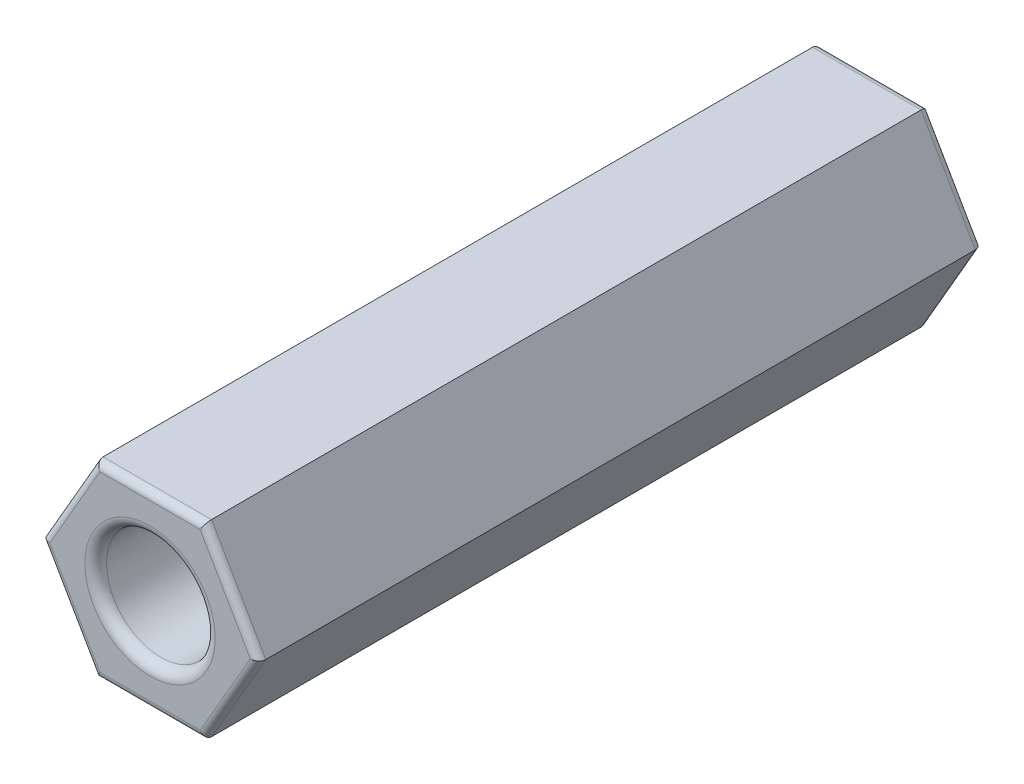
ISO-10303-21;
HEADER;
FILE_DESCRIPTION(('STEP AP214'),'2;1');
FILE_NAME('part.step','',(''),(''),'','','');
FILE_SCHEMA(('AUTOMOTIVE_DESIGN { 1 0 10303 214 1 1 1 1 }'));
ENDSEC;
DATA;
#1=APPLICATION_CONTEXT('core data for automotive mechanical design processes');
#2=APPLICATION_PROTOCOL_DEFINITION('international standard','automotive_design',2000,#1);
#3=PRODUCT_CONTEXT('',#1,'mechanical');
#4=PRODUCT('Part','Part','',(#3));
#5=PRODUCT_RELATED_PRODUCT_CATEGORY('part','',(#4));
#6=PRODUCT_DEFINITION_FORMATION('','',#4);
#7=PRODUCT_DEFINITION_CONTEXT('part definition',#1,'design');
#8=PRODUCT_DEFINITION('design','',#6,#7);
#9=PRODUCT_DEFINITION_SHAPE('','',#8);
#10=(LENGTH_UNIT() NAMED_UNIT(*) SI_UNIT(.MILLI.,.METRE.));
#11=(NAMED_UNIT(*) PLANE_ANGLE_UNIT() SI_UNIT($,.RADIAN.));
#12=(NAMED_UNIT(*) SI_UNIT($,.STERADIAN.) SOLID_ANGLE_UNIT());
#13=UNCERTAINTY_MEASURE_WITH_UNIT(LENGTH_MEASURE(1.E-05),#10,'distance_accuracy_value','');
#14=(GEOMETRIC_REPRESENTATION_CONTEXT(3) GLOBAL_UNCERTAINTY_ASSIGNED_CONTEXT((#13)) GLOBAL_UNIT_ASSIGNED_CONTEXT((#10,
#11,#12)) REPRESENTATION_CONTEXT('',''));
#15=CARTESIAN_POINT('',(0.,0.,0.));
#16=DIRECTION('',(0.,0.,1.));
#17=DIRECTION('',(1.,0.,0.));
#18=AXIS2_PLACEMENT_3D('',#15,#16,#17);
#19=CARTESIAN_POINT('',(0.,0.,20.));
#20=DIRECTION('',(0.,0.,1.));
#21=DIRECTION('',(1.,0.,0.));
#22=AXIS2_PLACEMENT_3D('',#19,#20,#21);
#23=PLANE('',#22);
#24=DIRECTION('',(-1.,0.,0.));
#25=VECTOR('',#24,1.);
#26=CARTESIAN_POINT('',(-1.50000000000001,2.39807621135331,20.));
#27=LINE('',#26,#25);
#28=CARTESIAN_POINT('',(1.38452994616207,2.39807621135332,20.));
#29=VERTEX_POINT('',#28);
#30=CARTESIAN_POINT('',(-1.38452994616209,2.39807621135331,20.));
#31=VERTEX_POINT('',#30);
#32=EDGE_CURVE('E128',#29,#31,#27,.T.);
#33=ORIENTED_EDGE('',*,*,#32,.T.);
#34=DIRECTION('',(-0.499999999999995,-0.866025403784442,0.));
#35=VECTOR('',#34,1.);
#36=CARTESIAN_POINT('',(-2.82679491924311,-0.10000000000002,20.));
#37=LINE('',#36,#35);
#38=CARTESIAN_POINT('',(-2.76905989232415,0.,20.));
#39=VERTEX_POINT('',#38);
#40=EDGE_CURVE('E161',#31,#39,#37,.T.);
#41=ORIENTED_EDGE('',*,*,#40,.T.);
#42=DIRECTION('',(0.500000000000007,-0.866025403784435,0.));
#43=VECTOR('',#42,1.);
#44=CARTESIAN_POINT('',(-1.32679491924309,-2.49807621135333,20.));
#45=LINE('',#44,#43);
#46=CARTESIAN_POINT('',(-1.38452994616205,-2.39807621135333,20.));
#47=VERTEX_POINT('',#46);
#48=EDGE_CURVE('E159',#39,#47,#45,.T.);
#49=ORIENTED_EDGE('',*,*,#48,.T.);
#50=DIRECTION('',(1.,0.,0.));
#51=VECTOR('',#50,1.);
#52=CARTESIAN_POINT('',(1.50000000000003,-2.3980762113533,20.));
#53=LINE('',#52,#51);
#54=CARTESIAN_POINT('',(1.3845299461621,-2.3980762113533,20.));
#55=VERTEX_POINT('',#54);
#56=EDGE_CURVE('E157',#47,#55,#53,.T.);
#57=ORIENTED_EDGE('',*,*,#56,.T.);
#58=DIRECTION('',(0.499999999999995,0.866025403784442,0.));
#59=VECTOR('',#58,1.);
#60=CARTESIAN_POINT('',(2.82679491924311,0.0999999999999994,20.));
#61=LINE('',#60,#59);
#62=CARTESIAN_POINT('',(2.76905989232415,0.,20.));
#63=VERTEX_POINT('',#62);
#64=EDGE_CURVE('E131',#55,#63,#61,.T.);
#65=ORIENTED_EDGE('',*,*,#64,.T.);
#66=DIRECTION('',(-0.500000000000001,0.866025403784438,0.));
#67=VECTOR('',#66,1.);
#68=CARTESIAN_POINT('',(1.32679491924311,2.49807621135332,20.));
#69=LINE('',#68,#67);
#70=EDGE_CURVE('E123',#63,#29,#69,.T.);
#71=ORIENTED_EDGE('',*,*,#70,.T.);
#72=EDGE_LOOP('',(#33,#41,#49,#57,#65,#71));
#73=FACE_BOUND('',#72,.T.);
#74=CARTESIAN_POINT('',(0.,0.,20.));
#75=DIRECTION('',(0.,0.,1.));
#76=DIRECTION('',(1.,0.,0.));
#77=AXIS2_PLACEMENT_3D('',#74,#75,#76);
#78=CIRCLE('',#77,1.8);
#79=CARTESIAN_POINT('',(1.8,0.,20.));
#80=VERTEX_POINT('',#79);
#81=EDGE_CURVE('E149',#80,#80,#78,.F.);
#82=ORIENTED_EDGE('',*,*,#81,.T.);
#83=EDGE_LOOP('',(#82));
#84=FACE_BOUND('',#83,.T.);
#85=ADVANCED_FACE('F33',(#73,#84),#23,.T.);
#86=CARTESIAN_POINT('',(0.,0.,0.));
#87=DIRECTION('',(0.,0.,1.));
#88=DIRECTION('',(1.,0.,0.));
#89=AXIS2_PLACEMENT_3D('',#86,#87,#88);
#90=PLANE('',#89);
#91=DIRECTION('',(-0.500000000000001,0.866025403784438,0.));
#92=VECTOR('',#91,1.);
#93=CARTESIAN_POINT('',(2.07679491924311,1.19903810567666,0.));
#94=LINE('',#93,#92);
#95=CARTESIAN_POINT('',(1.38452994616207,2.39807621135332,0.));
#96=VERTEX_POINT('',#95);
#97=CARTESIAN_POINT('',(2.76905989232415,0.,0.));
#98=VERTEX_POINT('',#97);
#99=EDGE_CURVE('E188',#96,#98,#94,.F.);
#100=ORIENTED_EDGE('',*,*,#99,.T.);
#101=DIRECTION('',(0.499999999999995,0.866025403784442,0.));
#102=VECTOR('',#101,1.);
#103=CARTESIAN_POINT('',(2.07679491924313,-1.19903810567665,0.));
#104=LINE('',#103,#102);
#105=CARTESIAN_POINT('',(1.3845299461621,-2.3980762113533,0.));
#106=VERTEX_POINT('',#105);
#107=EDGE_CURVE('E11',#98,#106,#104,.F.);
#108=ORIENTED_EDGE('',*,*,#107,.T.);
#109=DIRECTION('',(1.,0.,0.));
#110=VECTOR('',#109,1.);
#111=CARTESIAN_POINT('',(0.,-2.39807621135331,0.));
#112=LINE('',#111,#110);
#113=CARTESIAN_POINT('',(-1.38452994616205,-2.39807621135333,0.));
#114=VERTEX_POINT('',#113);
#115=EDGE_CURVE('E42',#106,#114,#112,.F.);
#116=ORIENTED_EDGE('',*,*,#115,.T.);
#117=DIRECTION('',(0.500000000000007,-0.866025403784435,0.));
#118=VECTOR('',#117,1.);
#119=CARTESIAN_POINT('',(-2.0767949192431,-1.19903810567667,0.));
#120=LINE('',#119,#118);
#121=CARTESIAN_POINT('',(-2.76905989232415,0.,0.));
#122=VERTEX_POINT('',#121);
#123=EDGE_CURVE('E194',#114,#122,#120,.F.);
#124=ORIENTED_EDGE('',*,*,#123,.T.);
#125=DIRECTION('',(-0.499999999999995,-0.866025403784442,0.));
#126=VECTOR('',#125,1.);
#127=CARTESIAN_POINT('',(-2.07679491924312,1.19903810567665,0.));
#128=LINE('',#127,#126);
#129=CARTESIAN_POINT('',(-1.38452994616209,2.39807621135331,0.));
#130=VERTEX_POINT('',#129);
#131=EDGE_CURVE('E192',#122,#130,#128,.F.);
#132=ORIENTED_EDGE('',*,*,#131,.T.);
#133=DIRECTION('',(-1.,0.,0.));
#134=VECTOR('',#133,1.);
#135=CARTESIAN_POINT('',(0.,2.39807621135331,0.));
#136=LINE('',#135,#134);
#137=EDGE_CURVE('E190',#130,#96,#136,.F.);
#138=ORIENTED_EDGE('',*,*,#137,.T.);
#139=EDGE_LOOP('',(#100,#108,#116,#124,#132,#138));
#140=FACE_BOUND('',#139,.T.);
#141=CARTESIAN_POINT('',(0.,0.,0.));
#142=DIRECTION('',(0.,0.,1.));
#143=DIRECTION('',(1.,0.,0.));
#144=AXIS2_PLACEMENT_3D('',#141,#142,#143);
#145=CIRCLE('',#144,1.8);
#146=CARTESIAN_POINT('',(1.8,0.,0.));
#147=VERTEX_POINT('',#146);
#148=EDGE_CURVE('E252',#147,#147,#145,.T.);
#149=ORIENTED_EDGE('',*,*,#148,.T.);
#150=EDGE_LOOP('',(#149));
#151=FACE_BOUND('',#150,.T.);
#152=ADVANCED_FACE('F230',(#140,#151),#90,.F.);
#153=CARTESIAN_POINT('',(1.50000000000003,-2.5980762113533,20.));
#154=DIRECTION('',(-0.866025403784442,0.499999999999995,0.));
#155=DIRECTION('',(-0.499999999999995,-0.866025403784442,0.));
#156=AXIS2_PLACEMENT_3D('',#153,#154,#155);
#157=PLANE('',#156);
#158=DIRECTION('',(0.,0.,-1.));
#159=VECTOR('',#158,1.);
#160=CARTESIAN_POINT('',(3.,0.,20.));
#161=LINE('',#160,#159);
#162=CARTESIAN_POINT('',(3.,0.,19.8));
#163=VERTEX_POINT('',#162);
#164=CARTESIAN_POINT('',(3.,0.,0.199999999999999));
#165=VERTEX_POINT('',#164);
#166=EDGE_CURVE('E245',#163,#165,#161,.T.);
#167=ORIENTED_EDGE('',*,*,#166,.F.);
#168=DIRECTION('',(0.499999999999995,0.866025403784442,0.));
#169=VECTOR('',#168,1.);
#170=CARTESIAN_POINT('',(1.50000000000003,-2.5980762113533,19.8));
#171=LINE('',#170,#169);
#172=CARTESIAN_POINT('',(1.50000000000003,-2.5980762113533,19.8));
#173=VERTEX_POINT('',#172);
#174=EDGE_CURVE('E179',#163,#173,#171,.F.);
#175=ORIENTED_EDGE('',*,*,#174,.T.);
#176=DIRECTION('',(0.,0.,-1.));
#177=VECTOR('',#176,1.);
#178=CARTESIAN_POINT('',(1.50000000000003,-2.5980762113533,20.));
#179=LINE('',#178,#177);
#180=CARTESIAN_POINT('',(1.50000000000003,-2.5980762113533,0.199999999999999));
#181=VERTEX_POINT('',#180);
#182=EDGE_CURVE('E206',#173,#181,#179,.T.);
#183=ORIENTED_EDGE('',*,*,#182,.T.);
#184=DIRECTION('',(0.499999999999995,0.866025403784442,0.));
#185=VECTOR('',#184,1.);
#186=CARTESIAN_POINT('',(1.50000000000003,-2.5980762113533,0.199999999999999));
#187=LINE('',#186,#185);
#188=EDGE_CURVE('E176',#181,#165,#187,.T.);
#189=ORIENTED_EDGE('',*,*,#188,.T.);
#190=EDGE_LOOP('',(#167,#175,#183,#189));
#191=FACE_BOUND('',#190,.T.);
#192=ADVANCED_FACE('F244',(#191),#157,.F.);
#193=CARTESIAN_POINT('',(3.,0.,20.));
#194=DIRECTION('',(-0.866025403784438,-0.500000000000001,0.));
#195=DIRECTION('',(0.500000000000001,-0.866025403784438,0.));
#196=AXIS2_PLACEMENT_3D('',#193,#194,#195);
#197=PLANE('',#196);
#198=DIRECTION('',(0.,0.,-1.));
#199=VECTOR('',#198,1.);
#200=CARTESIAN_POINT('',(1.49999999999999,2.59807621135332,20.));
#201=LINE('',#200,#199);
#202=CARTESIAN_POINT('',(1.49999999999999,2.59807621135332,19.8));
#203=VERTEX_POINT('',#202);
#204=CARTESIAN_POINT('',(1.49999999999999,2.59807621135332,0.199999999999999));
#205=VERTEX_POINT('',#204);
#206=EDGE_CURVE('E253',#203,#205,#201,.T.);
#207=ORIENTED_EDGE('',*,*,#206,.F.);
#208=DIRECTION('',(-0.500000000000001,0.866025403784438,0.));
#209=VECTOR('',#208,1.);
#210=CARTESIAN_POINT('',(3.,0.,19.8));
#211=LINE('',#210,#209);
#212=EDGE_CURVE('E140',#203,#163,#211,.F.);
#213=ORIENTED_EDGE('',*,*,#212,.T.);
#214=ORIENTED_EDGE('',*,*,#166,.T.);
#215=DIRECTION('',(-0.500000000000001,0.866025403784438,0.));
#216=VECTOR('',#215,1.);
#217=CARTESIAN_POINT('',(3.,0.,0.199999999999999));
#218=LINE('',#217,#216);
#219=EDGE_CURVE('E181',#165,#205,#218,.T.);
#220=ORIENTED_EDGE('',*,*,#219,.T.);
#221=EDGE_LOOP('',(#207,#213,#214,#220));
#222=FACE_BOUND('',#221,.T.);
#223=ADVANCED_FACE('F250',(#222),#197,.F.);
#224=CARTESIAN_POINT('',(1.49999999999999,2.59807621135332,20.));
#225=DIRECTION('',(0.,-1.,0.));
#226=DIRECTION('',(1.,0.,0.));
#227=AXIS2_PLACEMENT_3D('',#224,#225,#226);
#228=PLANE('',#227);
#229=DIRECTION('',(0.,0.,-1.));
#230=VECTOR('',#229,1.);
#231=CARTESIAN_POINT('',(-1.50000000000001,2.59807621135331,20.));
#232=LINE('',#231,#230);
#233=CARTESIAN_POINT('',(-1.50000000000001,2.59807621135331,19.8));
#234=VERTEX_POINT('',#233);
#235=CARTESIAN_POINT('',(-1.50000000000001,2.59807621135331,0.199999999999999));
#236=VERTEX_POINT('',#235);
#237=EDGE_CURVE('E258',#234,#236,#232,.T.);
#238=ORIENTED_EDGE('',*,*,#237,.F.);
#239=DIRECTION('',(-1.,0.,0.));
#240=VECTOR('',#239,1.);
#241=CARTESIAN_POINT('',(1.49999999999999,2.59807621135332,19.8));
#242=LINE('',#241,#240);
#243=EDGE_CURVE('E186',#234,#203,#242,.F.);
#244=ORIENTED_EDGE('',*,*,#243,.T.);
#245=ORIENTED_EDGE('',*,*,#206,.T.);
#246=DIRECTION('',(-1.,0.,0.));
#247=VECTOR('',#246,1.);
#248=CARTESIAN_POINT('',(1.49999999999999,2.59807621135332,0.199999999999999));
#249=LINE('',#248,#247);
#250=EDGE_CURVE('E184',#205,#236,#249,.T.);
#251=ORIENTED_EDGE('',*,*,#250,.T.);
#252=EDGE_LOOP('',(#238,#244,#245,#251));
#253=FACE_BOUND('',#252,.T.);
#254=ADVANCED_FACE('F296',(#253),#228,.F.);
#255=CARTESIAN_POINT('',(-1.50000000000001,2.59807621135331,20.));
#256=DIRECTION('',(0.866025403784442,-0.499999999999995,0.));
#257=DIRECTION('',(0.499999999999995,0.866025403784442,0.));
#258=AXIS2_PLACEMENT_3D('',#255,#256,#257);
#259=PLANE('',#258);
#260=DIRECTION('',(0.,0.,-1.));
#261=VECTOR('',#260,1.);
#262=CARTESIAN_POINT('',(-3.,0.,20.));
#263=LINE('',#262,#261);
#264=CARTESIAN_POINT('',(-3.,0.,19.8));
#265=VERTEX_POINT('',#264);
#266=CARTESIAN_POINT('',(-3.,0.,0.199999999999999));
#267=VERTEX_POINT('',#266);
#268=EDGE_CURVE('E481',#265,#267,#263,.T.);
#269=ORIENTED_EDGE('',*,*,#268,.F.);
#270=DIRECTION('',(-0.499999999999995,-0.866025403784442,0.));
#271=VECTOR('',#270,1.);
#272=CARTESIAN_POINT('',(-1.50000000000001,2.59807621135331,19.8));
#273=LINE('',#272,#271);
#274=EDGE_CURVE('E165',#265,#234,#273,.F.);
#275=ORIENTED_EDGE('',*,*,#274,.T.);
#276=ORIENTED_EDGE('',*,*,#237,.T.);
#277=DIRECTION('',(-0.499999999999995,-0.866025403784442,0.));
#278=VECTOR('',#277,1.);
#279=CARTESIAN_POINT('',(-1.50000000000001,2.59807621135331,0.199999999999999));
#280=LINE('',#279,#278);
#281=EDGE_CURVE('E163',#236,#267,#280,.T.);
#282=ORIENTED_EDGE('',*,*,#281,.T.);
#283=EDGE_LOOP('',(#269,#275,#276,#282));
#284=FACE_BOUND('',#283,.T.);
#285=ADVANCED_FACE('F292',(#284),#259,.F.);
#286=CARTESIAN_POINT('',(-3.,0.,20.));
#287=DIRECTION('',(0.866025403784435,0.500000000000007,0.));
#288=DIRECTION('',(-0.500000000000007,0.866025403784435,0.));
#289=AXIS2_PLACEMENT_3D('',#286,#287,#288);
#290=PLANE('',#289);
#291=DIRECTION('',(0.,0.,-1.));
#292=VECTOR('',#291,1.);
#293=CARTESIAN_POINT('',(-1.49999999999998,-2.59807621135333,20.));
#294=LINE('',#293,#292);
#295=CARTESIAN_POINT('',(-1.49999999999998,-2.59807621135333,19.8));
#296=VERTEX_POINT('',#295);
#297=CARTESIAN_POINT('',(-1.49999999999998,-2.59807621135333,0.199999999999999));
#298=VERTEX_POINT('',#297);
#299=EDGE_CURVE('E478',#296,#298,#294,.T.);
#300=ORIENTED_EDGE('',*,*,#299,.F.);
#301=DIRECTION('',(0.500000000000007,-0.866025403784435,0.));
#302=VECTOR('',#301,1.);
#303=CARTESIAN_POINT('',(-3.,0.,19.8));
#304=LINE('',#303,#302);
#305=EDGE_CURVE('E170',#296,#265,#304,.F.);
#306=ORIENTED_EDGE('',*,*,#305,.T.);
#307=ORIENTED_EDGE('',*,*,#268,.T.);
#308=DIRECTION('',(0.500000000000007,-0.866025403784435,0.));
#309=VECTOR('',#308,1.);
#310=CARTESIAN_POINT('',(-3.,0.,0.199999999999999));
#311=LINE('',#310,#309);
#312=EDGE_CURVE('E168',#267,#298,#311,.T.);
#313=ORIENTED_EDGE('',*,*,#312,.T.);
#314=EDGE_LOOP('',(#300,#306,#307,#313));
#315=FACE_BOUND('',#314,.T.);
#316=ADVANCED_FACE('F288',(#315),#290,.F.);
#317=CARTESIAN_POINT('',(-1.49999999999998,-2.59807621135333,20.));
#318=DIRECTION('',(0.,1.,0.));
#319=DIRECTION('',(-1.,0.,0.));
#320=AXIS2_PLACEMENT_3D('',#317,#318,#319);
#321=PLANE('',#320);
#322=ORIENTED_EDGE('',*,*,#182,.F.);
#323=DIRECTION('',(1.,0.,0.));
#324=VECTOR('',#323,1.);
#325=CARTESIAN_POINT('',(-1.49999999999998,-2.59807621135333,19.8));
#326=LINE('',#325,#324);
#327=EDGE_CURVE('E174',#173,#296,#326,.F.);
#328=ORIENTED_EDGE('',*,*,#327,.T.);
#329=ORIENTED_EDGE('',*,*,#299,.T.);
#330=DIRECTION('',(1.,0.,0.));
#331=VECTOR('',#330,1.);
#332=CARTESIAN_POINT('',(-1.49999999999998,-2.59807621135333,0.199999999999999));
#333=LINE('',#332,#331);
#334=EDGE_CURVE('E172',#298,#181,#333,.T.);
#335=ORIENTED_EDGE('',*,*,#334,.T.);
#336=EDGE_LOOP('',(#322,#328,#329,#335));
#337=FACE_BOUND('',#336,.T.);
#338=ADVANCED_FACE('F285',(#337),#321,.F.);
#339=CARTESIAN_POINT('',(0.,0.,20.));
#340=DIRECTION('',(0.,0.,-1.));
#341=DIRECTION('',(-1.,0.,0.));
#342=AXIS2_PLACEMENT_3D('',#339,#340,#341);
#343=CYLINDRICAL_SURFACE('',#342,1.5);
#344=CARTESIAN_POINT('',(0.,0.,0.300000000000002));
#345=DIRECTION('',(0.,0.,1.));
#346=DIRECTION('',(1.,0.,0.));
#347=AXIS2_PLACEMENT_3D('',#344,#345,#346);
#348=CIRCLE('',#347,1.5);
#349=CARTESIAN_POINT('',(1.5,0.,0.300000000000002));
#350=VERTEX_POINT('',#349);
#351=EDGE_CURVE('E152',#350,#350,#348,.F.);
#352=ORIENTED_EDGE('',*,*,#351,.T.);
#353=EDGE_LOOP('',(#352));
#354=FACE_BOUND('',#353,.T.);
#355=CARTESIAN_POINT('',(0.,0.,19.7));
#356=DIRECTION('',(0.,0.,1.));
#357=DIRECTION('',(1.,0.,0.));
#358=AXIS2_PLACEMENT_3D('',#355,#356,#357);
#359=CIRCLE('',#358,1.5);
#360=CARTESIAN_POINT('',(1.5,0.,19.7));
#361=VERTEX_POINT('',#360);
#362=EDGE_CURVE('E256',#361,#361,#359,.T.);
#363=ORIENTED_EDGE('',*,*,#362,.T.);
#364=EDGE_LOOP('',(#363));
#365=FACE_BOUND('',#364,.T.);
#366=ADVANCED_FACE('F266',(#354,#365),#343,.F.);
#367=CARTESIAN_POINT('',(0.,0.,0.300000000000002));
#368=DIRECTION('',(0.,0.,1.));
#369=DIRECTION('',(1.,0.,0.));
#370=AXIS2_PLACEMENT_3D('',#367,#368,#369);
#371=TOROIDAL_SURFACE('',#370,1.8,0.3);
#372=ORIENTED_EDGE('',*,*,#351,.F.);
#373=EDGE_LOOP('',(#372));
#374=FACE_BOUND('',#373,.T.);
#375=ORIENTED_EDGE('',*,*,#148,.F.);
#376=EDGE_LOOP('',(#375));
#377=FACE_BOUND('',#376,.T.);
#378=ADVANCED_FACE('F269',(#374,#377),#371,.T.);
#379=CARTESIAN_POINT('',(0.,0.,19.7));
#380=DIRECTION('',(0.,0.,1.));
#381=DIRECTION('',(1.,0.,0.));
#382=AXIS2_PLACEMENT_3D('',#379,#380,#381);
#383=TOROIDAL_SURFACE('',#382,1.8,0.3);
#384=ORIENTED_EDGE('',*,*,#81,.F.);
#385=EDGE_LOOP('',(#384));
#386=FACE_BOUND('',#385,.T.);
#387=ORIENTED_EDGE('',*,*,#362,.F.);
#388=EDGE_LOOP('',(#387));
#389=FACE_BOUND('',#388,.T.);
#390=ADVANCED_FACE('F272',(#386,#389),#383,.T.);
#391=CARTESIAN_POINT('',(2.07679491924313,-1.19903810567665,19.8));
#392=DIRECTION('',(-0.499999999999995,-0.866025403784442,0.));
#393=DIRECTION('',(0.866025403784442,-0.499999999999995,0.));
#394=AXIS2_PLACEMENT_3D('',#391,#392,#393);
#395=CYLINDRICAL_SURFACE('',#394,0.2);
#396=CARTESIAN_POINT('',(1.3845299461621,-2.3980762113533,19.8));
#397=DIRECTION('',(-0.866025403784434,-0.500000000000007,0.));
#398=DIRECTION('',(0.500000000000007,-0.866025403784435,0.));
#399=AXIS2_PLACEMENT_3D('',#396,#397,#398);
#400=ELLIPSE('',#399,0.23094010767585,0.2);
#401=EDGE_CURVE('E143',#173,#55,#400,.T.);
#402=ORIENTED_EDGE('',*,*,#401,.F.);
#403=ORIENTED_EDGE('',*,*,#174,.F.);
#404=CARTESIAN_POINT('',(2.76905989232415,0.,19.8));
#405=DIRECTION('',(0.,-1.,0.));
#406=DIRECTION('',(1.,0.,0.));
#407=AXIS2_PLACEMENT_3D('',#404,#405,#406);
#408=ELLIPSE('',#407,0.23094010767585,0.2);
#409=EDGE_CURVE('E204',#63,#163,#408,.F.);
#410=ORIENTED_EDGE('',*,*,#409,.F.);
#411=ORIENTED_EDGE('',*,*,#64,.F.);
#412=EDGE_LOOP('',(#402,#403,#410,#411));
#413=FACE_BOUND('',#412,.T.);
#414=ADVANCED_FACE('F305',(#413),#395,.T.);
#415=CARTESIAN_POINT('',(2.07679491924311,1.19903810567666,19.8));
#416=DIRECTION('',(0.500000000000001,-0.866025403784438,0.));
#417=DIRECTION('',(0.866025403784438,0.500000000000001,0.));
#418=AXIS2_PLACEMENT_3D('',#415,#416,#417);
#419=CYLINDRICAL_SURFACE('',#418,0.2);
#420=ORIENTED_EDGE('',*,*,#409,.T.);
#421=ORIENTED_EDGE('',*,*,#212,.F.);
#422=CARTESIAN_POINT('',(1.38452994616207,2.39807621135332,19.8));
#423=DIRECTION('',(0.86602540378444,-0.499999999999998,0.));
#424=DIRECTION('',(0.499999999999998,0.86602540378444,0.));
#425=AXIS2_PLACEMENT_3D('',#422,#423,#424);
#426=ELLIPSE('',#425,0.23094010767585,0.2);
#427=EDGE_CURVE('E138',#29,#203,#426,.F.);
#428=ORIENTED_EDGE('',*,*,#427,.F.);
#429=ORIENTED_EDGE('',*,*,#70,.F.);
#430=EDGE_LOOP('',(#420,#421,#428,#429));
#431=FACE_BOUND('',#430,.T.);
#432=ADVANCED_FACE('F139',(#431),#419,.T.);
#433=CARTESIAN_POINT('',(0.,-2.39807621135331,19.8));
#434=DIRECTION('',(-1.,0.,0.));
#435=DIRECTION('',(0.,-1.,0.));
#436=AXIS2_PLACEMENT_3D('',#433,#434,#435);
#437=CYLINDRICAL_SURFACE('',#436,0.2);
#438=ORIENTED_EDGE('',*,*,#401,.T.);
#439=ORIENTED_EDGE('',*,*,#56,.F.);
#440=CARTESIAN_POINT('',(-1.38452994616205,-2.39807621135333,19.8));
#441=DIRECTION('',(-0.866025403784443,0.499999999999992,0.));
#442=DIRECTION('',(-0.499999999999992,-0.866025403784443,0.));
#443=AXIS2_PLACEMENT_3D('',#440,#441,#442);
#444=ELLIPSE('',#443,0.23094010767585,0.2);
#445=EDGE_CURVE('E144',#296,#47,#444,.T.);
#446=ORIENTED_EDGE('',*,*,#445,.F.);
#447=ORIENTED_EDGE('',*,*,#327,.F.);
#448=EDGE_LOOP('',(#438,#439,#446,#447));
#449=FACE_BOUND('',#448,.T.);
#450=ADVANCED_FACE('F317',(#449),#437,.T.);
#451=CARTESIAN_POINT('',(0.,2.39807621135331,19.8));
#452=DIRECTION('',(1.,0.,0.));
#453=DIRECTION('',(0.,1.,0.));
#454=AXIS2_PLACEMENT_3D('',#451,#452,#453);
#455=CYLINDRICAL_SURFACE('',#454,0.2);
#456=ORIENTED_EDGE('',*,*,#427,.T.);
#457=ORIENTED_EDGE('',*,*,#243,.F.);
#458=CARTESIAN_POINT('',(-1.38452994616209,2.39807621135331,19.8));
#459=DIRECTION('',(0.866025403784436,0.500000000000004,0.));
#460=DIRECTION('',(0.500000000000004,-0.866025403784436,0.));
#461=AXIS2_PLACEMENT_3D('',#458,#459,#460);
#462=ELLIPSE('',#461,0.23094010767585,0.2);
#463=EDGE_CURVE('E147',#31,#234,#462,.F.);
#464=ORIENTED_EDGE('',*,*,#463,.F.);
#465=ORIENTED_EDGE('',*,*,#32,.F.);
#466=EDGE_LOOP('',(#456,#457,#464,#465));
#467=FACE_BOUND('',#466,.T.);
#468=ADVANCED_FACE('F146',(#467),#455,.T.);
#469=CARTESIAN_POINT('',(-2.0767949192431,-1.19903810567667,19.8));
#470=DIRECTION('',(-0.500000000000007,0.866025403784435,0.));
#471=DIRECTION('',(-0.866025403784435,-0.500000000000007,0.));
#472=AXIS2_PLACEMENT_3D('',#469,#470,#471);
#473=CYLINDRICAL_SURFACE('',#472,0.2);
#474=ORIENTED_EDGE('',*,*,#445,.T.);
#475=ORIENTED_EDGE('',*,*,#48,.F.);
#476=CARTESIAN_POINT('',(-2.76905989232415,0.,19.8));
#477=DIRECTION('',(0.,1.,0.));
#478=DIRECTION('',(-1.,0.,0.));
#479=AXIS2_PLACEMENT_3D('',#476,#477,#478);
#480=ELLIPSE('',#479,0.23094010767585,0.2);
#481=EDGE_CURVE('E197',#265,#39,#480,.T.);
#482=ORIENTED_EDGE('',*,*,#481,.F.);
#483=ORIENTED_EDGE('',*,*,#305,.F.);
#484=EDGE_LOOP('',(#474,#475,#482,#483));
#485=FACE_BOUND('',#484,.T.);
#486=ADVANCED_FACE('F310',(#485),#473,.T.);
#487=CARTESIAN_POINT('',(-2.07679491924312,1.19903810567665,19.8));
#488=DIRECTION('',(0.499999999999995,0.866025403784442,0.));
#489=DIRECTION('',(-0.866025403784442,0.499999999999995,0.));
#490=AXIS2_PLACEMENT_3D('',#487,#488,#489);
#491=CYLINDRICAL_SURFACE('',#490,0.2);
#492=ORIENTED_EDGE('',*,*,#463,.T.);
#493=ORIENTED_EDGE('',*,*,#274,.F.);
#494=ORIENTED_EDGE('',*,*,#481,.T.);
#495=ORIENTED_EDGE('',*,*,#40,.F.);
#496=EDGE_LOOP('',(#492,#493,#494,#495));
#497=FACE_BOUND('',#496,.T.);
#498=ADVANCED_FACE('F307',(#497),#491,.T.);
#499=CARTESIAN_POINT('',(-1.32679491924312,2.49807621135331,0.199999999999999));
#500=DIRECTION('',(-0.499999999999995,-0.866025403784442,0.));
#501=DIRECTION('',(0.866025403784442,-0.499999999999995,0.));
#502=AXIS2_PLACEMENT_3D('',#499,#500,#501);
#503=CYLINDRICAL_SURFACE('',#502,0.2);
#504=CARTESIAN_POINT('',(-1.38452994616209,2.39807621135331,0.199999999999999));
#505=DIRECTION('',(-0.866025403784436,-0.500000000000004,0.));
#506=DIRECTION('',(-0.500000000000004,0.866025403784436,0.));
#507=AXIS2_PLACEMENT_3D('',#504,#505,#506);
#508=ELLIPSE('',#507,0.23094010767585,0.2);
#509=EDGE_CURVE('E215',#130,#236,#508,.F.);
#510=ORIENTED_EDGE('',*,*,#509,.F.);
#511=ORIENTED_EDGE('',*,*,#131,.F.);
#512=CARTESIAN_POINT('',(-2.76905989232415,0.,0.199999999999999));
#513=DIRECTION('',(0.,-1.,0.));
#514=DIRECTION('',(-1.,0.,0.));
#515=AXIS2_PLACEMENT_3D('',#512,#513,#514);
#516=ELLIPSE('',#515,0.23094010767585,0.2);
#517=EDGE_CURVE('E37',#267,#122,#516,.T.);
#518=ORIENTED_EDGE('',*,*,#517,.F.);
#519=ORIENTED_EDGE('',*,*,#281,.F.);
#520=EDGE_LOOP('',(#510,#511,#518,#519));
#521=FACE_BOUND('',#520,.T.);
#522=ADVANCED_FACE('F35',(#521),#503,.T.);
#523=CARTESIAN_POINT('',(-2.82679491924311,0.0999999999999805,0.199999999999999));
#524=DIRECTION('',(0.500000000000007,-0.866025403784435,0.));
#525=DIRECTION('',(0.866025403784435,0.500000000000007,0.));
#526=AXIS2_PLACEMENT_3D('',#523,#524,#525);
#527=CYLINDRICAL_SURFACE('',#526,0.2);
#528=ORIENTED_EDGE('',*,*,#517,.T.);
#529=ORIENTED_EDGE('',*,*,#123,.F.);
#530=CARTESIAN_POINT('',(-1.38452994616205,-2.39807621135333,0.199999999999999));
#531=DIRECTION('',(0.866025403784443,-0.499999999999992,0.));
#532=DIRECTION('',(-0.499999999999992,-0.866025403784443,0.));
#533=AXIS2_PLACEMENT_3D('',#530,#531,#532);
#534=ELLIPSE('',#533,0.23094010767585,0.2);
#535=EDGE_CURVE('E213',#298,#114,#534,.T.);
#536=ORIENTED_EDGE('',*,*,#535,.F.);
#537=ORIENTED_EDGE('',*,*,#312,.F.);
#538=EDGE_LOOP('',(#528,#529,#536,#537));
#539=FACE_BOUND('',#538,.T.);
#540=ADVANCED_FACE('F225',(#539),#527,.T.);
#541=CARTESIAN_POINT('',(1.49999999999999,2.39807621135332,0.199999999999999));
#542=DIRECTION('',(-1.,0.,0.));
#543=DIRECTION('',(0.,-1.,0.));
#544=AXIS2_PLACEMENT_3D('',#541,#542,#543);
#545=CYLINDRICAL_SURFACE('',#544,0.2);
#546=ORIENTED_EDGE('',*,*,#509,.T.);
#547=ORIENTED_EDGE('',*,*,#250,.F.);
#548=CARTESIAN_POINT('',(1.38452994616207,2.39807621135332,0.199999999999999));
#549=DIRECTION('',(-0.86602540378444,0.499999999999998,0.));
#550=DIRECTION('',(0.499999999999998,0.86602540378444,0.));
#551=AXIS2_PLACEMENT_3D('',#548,#549,#550);
#552=ELLIPSE('',#551,0.23094010767585,0.2);
#553=EDGE_CURVE('E210',#96,#205,#552,.F.);
#554=ORIENTED_EDGE('',*,*,#553,.F.);
#555=ORIENTED_EDGE('',*,*,#137,.F.);
#556=EDGE_LOOP('',(#546,#547,#554,#555));
#557=FACE_BOUND('',#556,.T.);
#558=ADVANCED_FACE('F234',(#557),#545,.T.);
#559=CARTESIAN_POINT('',(-1.49999999999998,-2.39807621135333,0.199999999999999));
#560=DIRECTION('',(1.,0.,0.));
#561=DIRECTION('',(0.,1.,0.));
#562=AXIS2_PLACEMENT_3D('',#559,#560,#561);
#563=CYLINDRICAL_SURFACE('',#562,0.2);
#564=ORIENTED_EDGE('',*,*,#535,.T.);
#565=ORIENTED_EDGE('',*,*,#115,.F.);
#566=CARTESIAN_POINT('',(1.3845299461621,-2.3980762113533,0.199999999999999));
#567=DIRECTION('',(0.866025403784434,0.500000000000007,0.));
#568=DIRECTION('',(0.500000000000007,-0.866025403784435,0.));
#569=AXIS2_PLACEMENT_3D('',#566,#567,#568);
#570=ELLIPSE('',#569,0.23094010767585,0.2);
#571=EDGE_CURVE('E50',#181,#106,#570,.T.);
#572=ORIENTED_EDGE('',*,*,#571,.F.);
#573=ORIENTED_EDGE('',*,*,#334,.F.);
#574=EDGE_LOOP('',(#564,#565,#572,#573));
#575=FACE_BOUND('',#574,.T.);
#576=ADVANCED_FACE('F330',(#575),#563,.T.);
#577=CARTESIAN_POINT('',(2.82679491924311,-0.1,0.199999999999999));
#578=DIRECTION('',(-0.500000000000001,0.866025403784438,0.));
#579=DIRECTION('',(-0.866025403784438,-0.500000000000001,0.));
#580=AXIS2_PLACEMENT_3D('',#577,#578,#579);
#581=CYLINDRICAL_SURFACE('',#580,0.2);
#582=ORIENTED_EDGE('',*,*,#553,.T.);
#583=ORIENTED_EDGE('',*,*,#219,.F.);
#584=CARTESIAN_POINT('',(2.76905989232415,0.,0.199999999999999));
#585=DIRECTION('',(0.,1.,0.));
#586=DIRECTION('',(-1.,0.,0.));
#587=AXIS2_PLACEMENT_3D('',#584,#585,#586);
#588=ELLIPSE('',#587,0.23094010767585,0.2);
#589=EDGE_CURVE('E207',#98,#165,#588,.F.);
#590=ORIENTED_EDGE('',*,*,#589,.F.);
#591=ORIENTED_EDGE('',*,*,#99,.F.);
#592=EDGE_LOOP('',(#582,#583,#590,#591));
#593=FACE_BOUND('',#592,.T.);
#594=ADVANCED_FACE('F238',(#593),#581,.T.);
#595=CARTESIAN_POINT('',(1.32679491924314,-2.4980762113533,0.199999999999999));
#596=DIRECTION('',(0.499999999999995,0.866025403784442,0.));
#597=DIRECTION('',(-0.866025403784442,0.499999999999995,0.));
#598=AXIS2_PLACEMENT_3D('',#595,#596,#597);
#599=CYLINDRICAL_SURFACE('',#598,0.2);
#600=ORIENTED_EDGE('',*,*,#571,.T.);
#601=ORIENTED_EDGE('',*,*,#107,.F.);
#602=ORIENTED_EDGE('',*,*,#589,.T.);
#603=ORIENTED_EDGE('',*,*,#188,.F.);
#604=EDGE_LOOP('',(#600,#601,#602,#603));
#605=FACE_BOUND('',#604,.T.);
#606=ADVANCED_FACE('F239',(#605),#599,.T.);
#607=CLOSED_SHELL('',(#85,#152,#192,#223,#254,#285,#316,#338,#366,#378,#390,#414,#432,#450,#468,
#486,#498,#522,#540,#558,#576,#594,#606));
#608=MANIFOLD_SOLID_BREP('B2',#607);
#609=ADVANCED_BREP_SHAPE_REPRESENTATION('',(#18,#608),#14);
#610=SHAPE_DEFINITION_REPRESENTATION(#9,#609);
ENDSEC;
END-ISO-10303-21;
